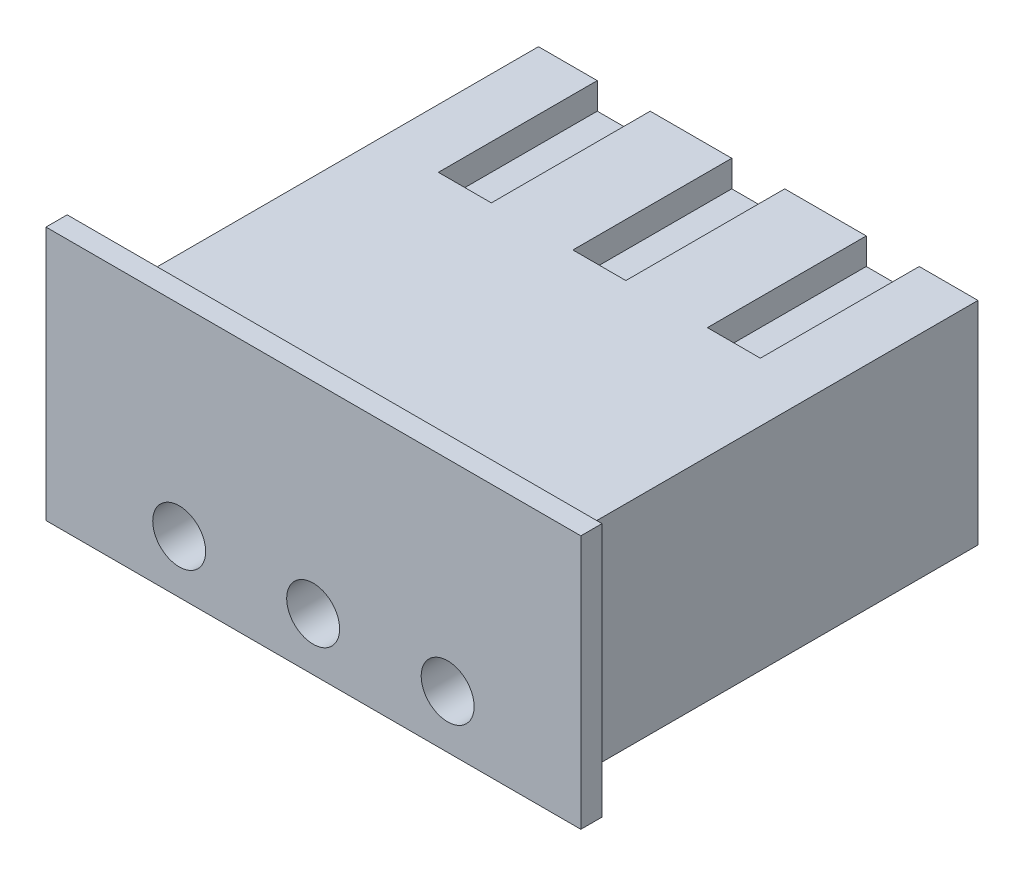
ISO-10303-21;
HEADER;
FILE_DESCRIPTION(('STEP AP214'),'2;1');
FILE_NAME('part.step','',(''),(''),'','','');
FILE_SCHEMA(('AUTOMOTIVE_DESIGN { 1 0 10303 214 1 1 1 1 }'));
ENDSEC;
DATA;
#1=APPLICATION_CONTEXT('core data for automotive mechanical design processes');
#2=APPLICATION_PROTOCOL_DEFINITION('international standard','automotive_design',2000,#1);
#3=PRODUCT_CONTEXT('',#1,'mechanical');
#4=PRODUCT('Part','Part','',(#3));
#5=PRODUCT_RELATED_PRODUCT_CATEGORY('part','',(#4));
#6=PRODUCT_DEFINITION_FORMATION('','',#4);
#7=PRODUCT_DEFINITION_CONTEXT('part definition',#1,'design');
#8=PRODUCT_DEFINITION('design','',#6,#7);
#9=PRODUCT_DEFINITION_SHAPE('','',#8);
#10=(LENGTH_UNIT() NAMED_UNIT(*) SI_UNIT(.MILLI.,.METRE.));
#11=(NAMED_UNIT(*) PLANE_ANGLE_UNIT() SI_UNIT($,.RADIAN.));
#12=(NAMED_UNIT(*) SI_UNIT($,.STERADIAN.) SOLID_ANGLE_UNIT());
#13=UNCERTAINTY_MEASURE_WITH_UNIT(LENGTH_MEASURE(1.E-05),#10,'distance_accuracy_value','');
#14=(GEOMETRIC_REPRESENTATION_CONTEXT(3) GLOBAL_UNCERTAINTY_ASSIGNED_CONTEXT((#13)) GLOBAL_UNIT_ASSIGNED_CONTEXT((#10,
#11,#12)) REPRESENTATION_CONTEXT('',''));
#15=CARTESIAN_POINT('',(0.,0.,0.));
#16=DIRECTION('',(0.,0.,1.));
#17=DIRECTION('',(1.,0.,0.));
#18=AXIS2_PLACEMENT_3D('',#15,#16,#17);
#19=CARTESIAN_POINT('',(0.,4.,8.));
#20=DIRECTION('',(0.,-1.,0.));
#21=DIRECTION('',(0.,0.,-1.));
#22=AXIS2_PLACEMENT_3D('',#19,#20,#21);
#23=PLANE('',#22);
#24=DIRECTION('',(0.,0.,1.));
#25=VECTOR('',#24,1.);
#26=CARTESIAN_POINT('',(1.11,4.,-1.2E-05));
#27=LINE('',#26,#25);
#28=CARTESIAN_POINT('',(1.11,4.,0.));
#29=VERTEX_POINT('',#28);
#30=CARTESIAN_POINT('',(1.11,4.,3.));
#31=VERTEX_POINT('',#30);
#32=EDGE_CURVE('E117',#29,#31,#27,.T.);
#33=ORIENTED_EDGE('',*,*,#32,.F.);
#34=DIRECTION('',(1.,0.,0.));
#35=VECTOR('',#34,1.);
#36=CARTESIAN_POINT('',(0.,4.,0.));
#37=LINE('',#36,#35);
#38=CARTESIAN_POINT('',(0.,4.,0.));
#39=VERTEX_POINT('',#38);
#40=EDGE_CURVE('E133',#29,#39,#37,.F.);
#41=ORIENTED_EDGE('',*,*,#40,.T.);
#42=DIRECTION('',(0.,0.,-1.));
#43=VECTOR('',#42,1.);
#44=CARTESIAN_POINT('',(0.,4.,8.));
#45=LINE('',#44,#43);
#46=CARTESIAN_POINT('',(0.,4.,8.));
#47=VERTEX_POINT('',#46);
#48=EDGE_CURVE('E250',#47,#39,#45,.T.);
#49=ORIENTED_EDGE('',*,*,#48,.F.);
#50=DIRECTION('',(-1.,0.,0.));
#51=VECTOR('',#50,1.);
#52=CARTESIAN_POINT('',(0.,4.,8.));
#53=LINE('',#52,#51);
#54=CARTESIAN_POINT('',(8.3,4.,8.));
#55=VERTEX_POINT('',#54);
#56=EDGE_CURVE('E245',#55,#47,#53,.T.);
#57=ORIENTED_EDGE('',*,*,#56,.F.);
#58=DIRECTION('',(0.,0.,-1.));
#59=VECTOR('',#58,1.);
#60=CARTESIAN_POINT('',(8.3,4.,8.));
#61=LINE('',#60,#59);
#62=CARTESIAN_POINT('',(8.3,4.,0.));
#63=VERTEX_POINT('',#62);
#64=EDGE_CURVE('E253',#55,#63,#61,.T.);
#65=ORIENTED_EDGE('',*,*,#64,.T.);
#66=DIRECTION('',(1.,0.,0.));
#67=VECTOR('',#66,1.);
#68=CARTESIAN_POINT('',(0.,4.,0.));
#69=LINE('',#68,#67);
#70=CARTESIAN_POINT('',(7.19,4.,0.));
#71=VERTEX_POINT('',#70);
#72=EDGE_CURVE('E243',#63,#71,#69,.F.);
#73=ORIENTED_EDGE('',*,*,#72,.T.);
#74=DIRECTION('',(0.,0.,1.));
#75=VECTOR('',#74,1.);
#76=CARTESIAN_POINT('',(7.19,4.,-1.2E-05));
#77=LINE('',#76,#75);
#78=CARTESIAN_POINT('',(7.19,4.,3.));
#79=VERTEX_POINT('',#78);
#80=EDGE_CURVE('E172',#71,#79,#77,.T.);
#81=ORIENTED_EDGE('',*,*,#80,.T.);
#82=DIRECTION('',(1.,0.,0.));
#83=VECTOR('',#82,1.);
#84=CARTESIAN_POINT('',(7.19,4.,3.));
#85=LINE('',#84,#83);
#86=CARTESIAN_POINT('',(6.19,4.,3.));
#87=VERTEX_POINT('',#86);
#88=EDGE_CURVE('E270',#87,#79,#85,.T.);
#89=ORIENTED_EDGE('',*,*,#88,.F.);
#90=DIRECTION('',(0.,0.,1.));
#91=VECTOR('',#90,1.);
#92=CARTESIAN_POINT('',(6.19,4.,-1.2E-05));
#93=LINE('',#92,#91);
#94=CARTESIAN_POINT('',(6.19,4.,0.));
#95=VERTEX_POINT('',#94);
#96=EDGE_CURVE('E180',#95,#87,#93,.T.);
#97=ORIENTED_EDGE('',*,*,#96,.F.);
#98=DIRECTION('',(1.,0.,0.));
#99=VECTOR('',#98,1.);
#100=CARTESIAN_POINT('',(0.,4.,0.));
#101=LINE('',#100,#99);
#102=CARTESIAN_POINT('',(4.65,4.,0.));
#103=VERTEX_POINT('',#102);
#104=EDGE_CURVE('E148',#95,#103,#101,.F.);
#105=ORIENTED_EDGE('',*,*,#104,.T.);
#106=DIRECTION('',(0.,0.,1.));
#107=VECTOR('',#106,1.);
#108=CARTESIAN_POINT('',(4.65,4.,-1.2E-05));
#109=LINE('',#108,#107);
#110=CARTESIAN_POINT('',(4.65,4.,3.));
#111=VERTEX_POINT('',#110);
#112=EDGE_CURVE('E189',#103,#111,#109,.T.);
#113=ORIENTED_EDGE('',*,*,#112,.T.);
#114=DIRECTION('',(1.,0.,0.));
#115=VECTOR('',#114,1.);
#116=CARTESIAN_POINT('',(4.65,4.,3.));
#117=LINE('',#116,#115);
#118=CARTESIAN_POINT('',(3.65,4.,3.));
#119=VERTEX_POINT('',#118);
#120=EDGE_CURVE('E265',#119,#111,#117,.T.);
#121=ORIENTED_EDGE('',*,*,#120,.F.);
#122=DIRECTION('',(0.,0.,1.));
#123=VECTOR('',#122,1.);
#124=CARTESIAN_POINT('',(3.65,4.,-1.2E-05));
#125=LINE('',#124,#123);
#126=CARTESIAN_POINT('',(3.65,4.,0.));
#127=VERTEX_POINT('',#126);
#128=EDGE_CURVE('E186',#127,#119,#125,.T.);
#129=ORIENTED_EDGE('',*,*,#128,.F.);
#130=DIRECTION('',(1.,0.,0.));
#131=VECTOR('',#130,1.);
#132=CARTESIAN_POINT('',(0.,4.,0.));
#133=LINE('',#132,#131);
#134=CARTESIAN_POINT('',(2.11,4.,0.));
#135=VERTEX_POINT('',#134);
#136=EDGE_CURVE('E142',#127,#135,#133,.F.);
#137=ORIENTED_EDGE('',*,*,#136,.T.);
#138=DIRECTION('',(0.,0.,1.));
#139=VECTOR('',#138,1.);
#140=CARTESIAN_POINT('',(2.11,4.,-1.2E-05));
#141=LINE('',#140,#139);
#142=CARTESIAN_POINT('',(2.11,4.,3.));
#143=VERTEX_POINT('',#142);
#144=EDGE_CURVE('E127',#135,#143,#141,.T.);
#145=ORIENTED_EDGE('',*,*,#144,.T.);
#146=DIRECTION('',(1.,0.,0.));
#147=VECTOR('',#146,1.);
#148=CARTESIAN_POINT('',(2.11,4.,3.));
#149=LINE('',#148,#147);
#150=EDGE_CURVE('E135',#31,#143,#149,.T.);
#151=ORIENTED_EDGE('',*,*,#150,.F.);
#152=EDGE_LOOP('',(#33,#41,#49,#57,#65,#73,#81,#89,#97,#105,#113,#121,#129,#137,#145,#151));
#153=FACE_BOUND('',#152,.T.);
#154=ADVANCED_FACE('F43',(#153),#23,.F.);
#155=CARTESIAN_POINT('',(0.,0.,8.));
#156=DIRECTION('',(1.,0.,0.));
#157=DIRECTION('',(0.,0.,-1.));
#158=AXIS2_PLACEMENT_3D('',#155,#156,#157);
#159=PLANE('',#158);
#160=DIRECTION('',(0.,-1.,0.));
#161=VECTOR('',#160,1.);
#162=CARTESIAN_POINT('',(0.,0.,0.));
#163=LINE('',#162,#161);
#164=CARTESIAN_POINT('',(0.,0.,0.));
#165=VERTEX_POINT('',#164);
#166=EDGE_CURVE('E143',#39,#165,#163,.T.);
#167=ORIENTED_EDGE('',*,*,#166,.T.);
#168=DIRECTION('',(0.,0.,-1.));
#169=VECTOR('',#168,1.);
#170=CARTESIAN_POINT('',(0.,0.,8.));
#171=LINE('',#170,#169);
#172=CARTESIAN_POINT('',(0.,0.,8.));
#173=VERTEX_POINT('',#172);
#174=EDGE_CURVE('E11',#173,#165,#171,.T.);
#175=ORIENTED_EDGE('',*,*,#174,.F.);
#176=DIRECTION('',(0.,-1.,0.));
#177=VECTOR('',#176,1.);
#178=CARTESIAN_POINT('',(0.,0.,8.));
#179=LINE('',#178,#177);
#180=EDGE_CURVE('E240',#47,#173,#179,.T.);
#181=ORIENTED_EDGE('',*,*,#180,.F.);
#182=ORIENTED_EDGE('',*,*,#48,.T.);
#183=EDGE_LOOP('',(#167,#175,#181,#182));
#184=FACE_BOUND('',#183,.T.);
#185=ADVANCED_FACE('F44',(#184),#159,.F.);
#186=CARTESIAN_POINT('',(0.,0.,8.));
#187=DIRECTION('',(0.,1.,0.));
#188=DIRECTION('',(0.,0.,1.));
#189=AXIS2_PLACEMENT_3D('',#186,#187,#188);
#190=PLANE('',#189);
#191=DIRECTION('',(1.,0.,0.));
#192=VECTOR('',#191,1.);
#193=CARTESIAN_POINT('',(0.,0.,0.));
#194=LINE('',#193,#192);
#195=CARTESIAN_POINT('',(8.3,0.,0.));
#196=VERTEX_POINT('',#195);
#197=EDGE_CURVE('E146',#165,#196,#194,.T.);
#198=ORIENTED_EDGE('',*,*,#197,.T.);
#199=DIRECTION('',(0.,0.,-1.));
#200=VECTOR('',#199,1.);
#201=CARTESIAN_POINT('',(8.3,0.,8.));
#202=LINE('',#201,#200);
#203=CARTESIAN_POINT('',(8.3,0.,8.));
#204=VERTEX_POINT('',#203);
#205=EDGE_CURVE('E52',#204,#196,#202,.T.);
#206=ORIENTED_EDGE('',*,*,#205,.F.);
#207=DIRECTION('',(1.,0.,0.));
#208=VECTOR('',#207,1.);
#209=CARTESIAN_POINT('',(-0.9,0.,8.));
#210=LINE('',#209,#208);
#211=CARTESIAN_POINT('',(9.2,0.,8.));
#212=VERTEX_POINT('',#211);
#213=EDGE_CURVE('E220',#204,#212,#210,.T.);
#214=ORIENTED_EDGE('',*,*,#213,.T.);
#215=DIRECTION('',(0.,0.,-1.));
#216=VECTOR('',#215,1.);
#217=CARTESIAN_POINT('',(9.2,0.,8.4));
#218=LINE('',#217,#216);
#219=CARTESIAN_POINT('',(9.2,0.,8.4));
#220=VERTEX_POINT('',#219);
#221=EDGE_CURVE('E233',#220,#212,#218,.T.);
#222=ORIENTED_EDGE('',*,*,#221,.F.);
#223=DIRECTION('',(1.,0.,0.));
#224=VECTOR('',#223,1.);
#225=CARTESIAN_POINT('',(-0.9,0.,8.4));
#226=LINE('',#225,#224);
#227=CARTESIAN_POINT('',(-0.9,0.,8.4));
#228=VERTEX_POINT('',#227);
#229=EDGE_CURVE('E204',#228,#220,#226,.T.);
#230=ORIENTED_EDGE('',*,*,#229,.F.);
#231=DIRECTION('',(0.,0.,-1.));
#232=VECTOR('',#231,1.);
#233=CARTESIAN_POINT('',(-0.9,0.,8.4));
#234=LINE('',#233,#232);
#235=CARTESIAN_POINT('',(-0.9,0.,8.));
#236=VERTEX_POINT('',#235);
#237=EDGE_CURVE('E232',#228,#236,#234,.T.);
#238=ORIENTED_EDGE('',*,*,#237,.T.);
#239=EDGE_CURVE('E217',#236,#173,#210,.T.);
#240=ORIENTED_EDGE('',*,*,#239,.T.);
#241=ORIENTED_EDGE('',*,*,#174,.T.);
#242=EDGE_LOOP('',(#198,#206,#214,#222,#230,#238,#240,#241));
#243=FACE_BOUND('',#242,.T.);
#244=ADVANCED_FACE('F368',(#243),#190,.F.);
#245=CARTESIAN_POINT('',(8.3,0.,8.));
#246=DIRECTION('',(-1.,0.,0.));
#247=DIRECTION('',(0.,0.,1.));
#248=AXIS2_PLACEMENT_3D('',#245,#246,#247);
#249=PLANE('',#248);
#250=DIRECTION('',(0.,1.,0.));
#251=VECTOR('',#250,1.);
#252=CARTESIAN_POINT('',(8.3,0.,0.));
#253=LINE('',#252,#251);
#254=EDGE_CURVE('E141',#196,#63,#253,.T.);
#255=ORIENTED_EDGE('',*,*,#254,.T.);
#256=ORIENTED_EDGE('',*,*,#64,.F.);
#257=DIRECTION('',(0.,1.,0.));
#258=VECTOR('',#257,1.);
#259=CARTESIAN_POINT('',(8.3,0.,8.));
#260=LINE('',#259,#258);
#261=EDGE_CURVE('E238',#204,#55,#260,.T.);
#262=ORIENTED_EDGE('',*,*,#261,.F.);
#263=ORIENTED_EDGE('',*,*,#205,.T.);
#264=EDGE_LOOP('',(#255,#256,#262,#263));
#265=FACE_BOUND('',#264,.T.);
#266=ADVANCED_FACE('F367',(#265),#249,.F.);
#267=CARTESIAN_POINT('',(0.,0.,0.));
#268=DIRECTION('',(0.,0.,-1.));
#269=DIRECTION('',(-1.,0.,0.));
#270=AXIS2_PLACEMENT_3D('',#267,#268,#269);
#271=PLANE('',#270);
#272=CARTESIAN_POINT('',(6.68483856446167,0.999999999999999,0.));
#273=DIRECTION('',(0.,0.,-1.));
#274=DIRECTION('',(-1.,0.,0.));
#275=AXIS2_PLACEMENT_3D('',#272,#273,#274);
#276=CIRCLE('',#275,0.500000000000001);
#277=CARTESIAN_POINT('',(6.18483856446167,0.999999999999999,0.));
#278=VERTEX_POINT('',#277);
#279=EDGE_CURVE('E154',#278,#278,#276,.T.);
#280=ORIENTED_EDGE('',*,*,#279,.F.);
#281=EDGE_LOOP('',(#280));
#282=FACE_BOUND('',#281,.T.);
#283=CARTESIAN_POINT('',(4.14483856446167,0.999999999999999,0.));
#284=DIRECTION('',(0.,0.,-1.));
#285=DIRECTION('',(-1.,0.,0.));
#286=AXIS2_PLACEMENT_3D('',#283,#284,#285);
#287=CIRCLE('',#286,0.5);
#288=CARTESIAN_POINT('',(3.64483856446167,0.999999999999999,0.));
#289=VERTEX_POINT('',#288);
#290=EDGE_CURVE('E421',#289,#289,#287,.T.);
#291=ORIENTED_EDGE('',*,*,#290,.F.);
#292=EDGE_LOOP('',(#291));
#293=FACE_BOUND('',#292,.T.);
#294=CARTESIAN_POINT('',(1.61516143553833,1.,0.));
#295=DIRECTION('',(0.,0.,-1.));
#296=DIRECTION('',(-1.,0.,0.));
#297=AXIS2_PLACEMENT_3D('',#294,#295,#296);
#298=CIRCLE('',#297,0.5);
#299=CARTESIAN_POINT('',(1.11516143553833,1.,0.));
#300=VERTEX_POINT('',#299);
#301=EDGE_CURVE('E426',#300,#300,#298,.T.);
#302=ORIENTED_EDGE('',*,*,#301,.F.);
#303=EDGE_LOOP('',(#302));
#304=FACE_BOUND('',#303,.T.);
#305=DIRECTION('',(0.,-1.,0.));
#306=VECTOR('',#305,1.);
#307=CARTESIAN_POINT('',(2.11,4.,0.));
#308=LINE('',#307,#306);
#309=CARTESIAN_POINT('',(2.11,3.5,0.));
#310=VERTEX_POINT('',#309);
#311=EDGE_CURVE('E269',#135,#310,#308,.T.);
#312=ORIENTED_EDGE('',*,*,#311,.F.);
#313=ORIENTED_EDGE('',*,*,#136,.F.);
#314=DIRECTION('',(0.,1.,0.));
#315=VECTOR('',#314,1.);
#316=CARTESIAN_POINT('',(3.65,4.,0.));
#317=LINE('',#316,#315);
#318=CARTESIAN_POINT('',(3.65,3.5,0.));
#319=VERTEX_POINT('',#318);
#320=EDGE_CURVE('E193',#319,#127,#317,.T.);
#321=ORIENTED_EDGE('',*,*,#320,.F.);
#322=DIRECTION('',(-1.,0.,0.));
#323=VECTOR('',#322,1.);
#324=CARTESIAN_POINT('',(4.65,3.5,0.));
#325=LINE('',#324,#323);
#326=CARTESIAN_POINT('',(4.65,3.5,0.));
#327=VERTEX_POINT('',#326);
#328=EDGE_CURVE('E256',#327,#319,#325,.T.);
#329=ORIENTED_EDGE('',*,*,#328,.F.);
#330=DIRECTION('',(0.,-1.,0.));
#331=VECTOR('',#330,1.);
#332=CARTESIAN_POINT('',(4.65,4.,0.));
#333=LINE('',#332,#331);
#334=EDGE_CURVE('E257',#103,#327,#333,.T.);
#335=ORIENTED_EDGE('',*,*,#334,.F.);
#336=ORIENTED_EDGE('',*,*,#104,.F.);
#337=DIRECTION('',(0.,1.,0.));
#338=VECTOR('',#337,1.);
#339=CARTESIAN_POINT('',(6.19,4.,0.));
#340=LINE('',#339,#338);
#341=CARTESIAN_POINT('',(6.19,3.5,0.));
#342=VERTEX_POINT('',#341);
#343=EDGE_CURVE('E178',#342,#95,#340,.T.);
#344=ORIENTED_EDGE('',*,*,#343,.F.);
#345=DIRECTION('',(-1.,0.,0.));
#346=VECTOR('',#345,1.);
#347=CARTESIAN_POINT('',(7.19,3.5,0.));
#348=LINE('',#347,#346);
#349=CARTESIAN_POINT('',(7.19,3.5,0.));
#350=VERTEX_POINT('',#349);
#351=EDGE_CURVE('E262',#350,#342,#348,.T.);
#352=ORIENTED_EDGE('',*,*,#351,.F.);
#353=DIRECTION('',(0.,-1.,0.));
#354=VECTOR('',#353,1.);
#355=CARTESIAN_POINT('',(7.19,4.,0.));
#356=LINE('',#355,#354);
#357=EDGE_CURVE('E266',#71,#350,#356,.T.);
#358=ORIENTED_EDGE('',*,*,#357,.F.);
#359=ORIENTED_EDGE('',*,*,#72,.F.);
#360=ORIENTED_EDGE('',*,*,#254,.F.);
#361=ORIENTED_EDGE('',*,*,#197,.F.);
#362=ORIENTED_EDGE('',*,*,#166,.F.);
#363=ORIENTED_EDGE('',*,*,#40,.F.);
#364=DIRECTION('',(0.,1.,0.));
#365=VECTOR('',#364,1.);
#366=CARTESIAN_POINT('',(1.11,4.,0.));
#367=LINE('',#366,#365);
#368=CARTESIAN_POINT('',(1.11,3.5,0.));
#369=VERTEX_POINT('',#368);
#370=EDGE_CURVE('E113',#369,#29,#367,.T.);
#371=ORIENTED_EDGE('',*,*,#370,.F.);
#372=DIRECTION('',(-1.,0.,0.));
#373=VECTOR('',#372,1.);
#374=CARTESIAN_POINT('',(2.11,3.5,0.));
#375=LINE('',#374,#373);
#376=EDGE_CURVE('E124',#310,#369,#375,.T.);
#377=ORIENTED_EDGE('',*,*,#376,.F.);
#378=EDGE_LOOP('',(#312,#313,#321,#329,#335,#336,#344,#352,#358,#359,#360,#361,#362,#363,#371,#377));
#379=FACE_BOUND('',#378,.T.);
#380=ADVANCED_FACE('F136',(#282,#293,#304,#379),#271,.T.);
#381=CARTESIAN_POINT('',(-0.9,0.,8.4));
#382=DIRECTION('',(1.,0.,0.));
#383=DIRECTION('',(0.,0.,-1.));
#384=AXIS2_PLACEMENT_3D('',#381,#382,#383);
#385=PLANE('',#384);
#386=DIRECTION('',(0.,-1.,0.));
#387=VECTOR('',#386,1.);
#388=CARTESIAN_POINT('',(-0.9,0.,8.));
#389=LINE('',#388,#387);
#390=CARTESIAN_POINT('',(-0.9,4.8,8.));
#391=VERTEX_POINT('',#390);
#392=EDGE_CURVE('E194',#391,#236,#389,.T.);
#393=ORIENTED_EDGE('',*,*,#392,.T.);
#394=ORIENTED_EDGE('',*,*,#237,.F.);
#395=DIRECTION('',(0.,-1.,0.));
#396=VECTOR('',#395,1.);
#397=CARTESIAN_POINT('',(-0.9,0.,8.4));
#398=LINE('',#397,#396);
#399=CARTESIAN_POINT('',(-0.9,4.8,8.4));
#400=VERTEX_POINT('',#399);
#401=EDGE_CURVE('E203',#400,#228,#398,.T.);
#402=ORIENTED_EDGE('',*,*,#401,.F.);
#403=DIRECTION('',(0.,0.,-1.));
#404=VECTOR('',#403,1.);
#405=CARTESIAN_POINT('',(-0.9,4.8,8.4));
#406=LINE('',#405,#404);
#407=EDGE_CURVE('E212',#400,#391,#406,.T.);
#408=ORIENTED_EDGE('',*,*,#407,.T.);
#409=EDGE_LOOP('',(#393,#394,#402,#408));
#410=FACE_BOUND('',#409,.T.);
#411=ADVANCED_FACE('F394',(#410),#385,.F.);
#412=CARTESIAN_POINT('',(9.2,0.,8.4));
#413=DIRECTION('',(-1.,0.,0.));
#414=DIRECTION('',(0.,0.,1.));
#415=AXIS2_PLACEMENT_3D('',#412,#413,#414);
#416=PLANE('',#415);
#417=DIRECTION('',(0.,1.,0.));
#418=VECTOR('',#417,1.);
#419=CARTESIAN_POINT('',(9.2,0.,8.));
#420=LINE('',#419,#418);
#421=CARTESIAN_POINT('',(9.2,4.8,8.));
#422=VERTEX_POINT('',#421);
#423=EDGE_CURVE('E222',#212,#422,#420,.T.);
#424=ORIENTED_EDGE('',*,*,#423,.T.);
#425=DIRECTION('',(0.,0.,-1.));
#426=VECTOR('',#425,1.);
#427=CARTESIAN_POINT('',(9.2,4.8,8.4));
#428=LINE('',#427,#426);
#429=CARTESIAN_POINT('',(9.2,4.8,8.4));
#430=VERTEX_POINT('',#429);
#431=EDGE_CURVE('E227',#430,#422,#428,.T.);
#432=ORIENTED_EDGE('',*,*,#431,.F.);
#433=DIRECTION('',(0.,1.,0.));
#434=VECTOR('',#433,1.);
#435=CARTESIAN_POINT('',(9.2,0.,8.4));
#436=LINE('',#435,#434);
#437=EDGE_CURVE('E208',#220,#430,#436,.T.);
#438=ORIENTED_EDGE('',*,*,#437,.F.);
#439=ORIENTED_EDGE('',*,*,#221,.T.);
#440=EDGE_LOOP('',(#424,#432,#438,#439));
#441=FACE_BOUND('',#440,.T.);
#442=ADVANCED_FACE('F385',(#441),#416,.F.);
#443=CARTESIAN_POINT('',(-0.9,4.8,8.4));
#444=DIRECTION('',(0.,-1.,0.));
#445=DIRECTION('',(0.,0.,-1.));
#446=AXIS2_PLACEMENT_3D('',#443,#444,#445);
#447=PLANE('',#446);
#448=DIRECTION('',(-1.,0.,0.));
#449=VECTOR('',#448,1.);
#450=CARTESIAN_POINT('',(-0.9,4.8,8.));
#451=LINE('',#450,#449);
#452=EDGE_CURVE('E202',#422,#391,#451,.T.);
#453=ORIENTED_EDGE('',*,*,#452,.T.);
#454=ORIENTED_EDGE('',*,*,#407,.F.);
#455=DIRECTION('',(-1.,0.,0.));
#456=VECTOR('',#455,1.);
#457=CARTESIAN_POINT('',(-0.9,4.8,8.4));
#458=LINE('',#457,#456);
#459=EDGE_CURVE('E211',#430,#400,#458,.T.);
#460=ORIENTED_EDGE('',*,*,#459,.F.);
#461=ORIENTED_EDGE('',*,*,#431,.T.);
#462=EDGE_LOOP('',(#453,#454,#460,#461));
#463=FACE_BOUND('',#462,.T.);
#464=ADVANCED_FACE('F483',(#463),#447,.F.);
#465=CARTESIAN_POINT('',(0.,0.,8.4));
#466=DIRECTION('',(0.,0.,-1.));
#467=DIRECTION('',(-1.,0.,0.));
#468=AXIS2_PLACEMENT_3D('',#465,#466,#467);
#469=PLANE('',#468);
#470=CARTESIAN_POINT('',(6.68483856446167,0.999999999999999,8.4));
#471=DIRECTION('',(0.,0.,-1.));
#472=DIRECTION('',(-1.,0.,0.));
#473=AXIS2_PLACEMENT_3D('',#470,#471,#472);
#474=CIRCLE('',#473,0.500000000000001);
#475=CARTESIAN_POINT('',(6.18483856446167,0.999999999999999,8.4));
#476=VERTEX_POINT('',#475);
#477=EDGE_CURVE('E50',#476,#476,#474,.T.);
#478=ORIENTED_EDGE('',*,*,#477,.T.);
#479=EDGE_LOOP('',(#478));
#480=FACE_BOUND('',#479,.T.);
#481=CARTESIAN_POINT('',(4.14483856446167,0.999999999999999,8.4));
#482=DIRECTION('',(0.,0.,-1.));
#483=DIRECTION('',(-1.,0.,0.));
#484=AXIS2_PLACEMENT_3D('',#481,#482,#483);
#485=CIRCLE('',#484,0.5);
#486=CARTESIAN_POINT('',(3.64483856446167,0.999999999999999,8.4));
#487=VERTEX_POINT('',#486);
#488=EDGE_CURVE('E152',#487,#487,#485,.T.);
#489=ORIENTED_EDGE('',*,*,#488,.T.);
#490=EDGE_LOOP('',(#489));
#491=FACE_BOUND('',#490,.T.);
#492=CARTESIAN_POINT('',(1.61516143553833,1.,8.4));
#493=DIRECTION('',(0.,0.,-1.));
#494=DIRECTION('',(-1.,0.,0.));
#495=AXIS2_PLACEMENT_3D('',#492,#493,#494);
#496=CIRCLE('',#495,0.5);
#497=CARTESIAN_POINT('',(1.11516143553833,1.,8.4));
#498=VERTEX_POINT('',#497);
#499=EDGE_CURVE('E155',#498,#498,#496,.T.);
#500=ORIENTED_EDGE('',*,*,#499,.T.);
#501=EDGE_LOOP('',(#500));
#502=FACE_BOUND('',#501,.T.);
#503=ORIENTED_EDGE('',*,*,#401,.T.);
#504=ORIENTED_EDGE('',*,*,#229,.T.);
#505=ORIENTED_EDGE('',*,*,#437,.T.);
#506=ORIENTED_EDGE('',*,*,#459,.T.);
#507=EDGE_LOOP('',(#503,#504,#505,#506));
#508=FACE_BOUND('',#507,.T.);
#509=ADVANCED_FACE('F387',(#480,#491,#502,#508),#469,.F.);
#510=CARTESIAN_POINT('',(0.,0.,8.));
#511=DIRECTION('',(0.,0.,-1.));
#512=DIRECTION('',(-1.,0.,0.));
#513=AXIS2_PLACEMENT_3D('',#510,#511,#512);
#514=PLANE('',#513);
#515=ORIENTED_EDGE('',*,*,#56,.T.);
#516=ORIENTED_EDGE('',*,*,#180,.T.);
#517=ORIENTED_EDGE('',*,*,#239,.F.);
#518=ORIENTED_EDGE('',*,*,#392,.F.);
#519=ORIENTED_EDGE('',*,*,#452,.F.);
#520=ORIENTED_EDGE('',*,*,#423,.F.);
#521=ORIENTED_EDGE('',*,*,#213,.F.);
#522=ORIENTED_EDGE('',*,*,#261,.T.);
#523=EDGE_LOOP('',(#515,#516,#517,#518,#519,#520,#521,#522));
#524=FACE_BOUND('',#523,.T.);
#525=ADVANCED_FACE('F376',(#524),#514,.T.);
#526=CARTESIAN_POINT('',(4.65,4.,-1.2E-05));
#527=DIRECTION('',(-1.,0.,0.));
#528=DIRECTION('',(0.,-1.,0.));
#529=AXIS2_PLACEMENT_3D('',#526,#527,#528);
#530=PLANE('',#529);
#531=ORIENTED_EDGE('',*,*,#112,.F.);
#532=ORIENTED_EDGE('',*,*,#334,.T.);
#533=DIRECTION('',(0.,0.,1.));
#534=VECTOR('',#533,1.);
#535=CARTESIAN_POINT('',(4.65,3.5,-1.2E-05));
#536=LINE('',#535,#534);
#537=CARTESIAN_POINT('',(4.65,3.5,3.));
#538=VERTEX_POINT('',#537);
#539=EDGE_CURVE('E195',#327,#538,#536,.T.);
#540=ORIENTED_EDGE('',*,*,#539,.T.);
#541=DIRECTION('',(0.,-1.,0.));
#542=VECTOR('',#541,1.);
#543=CARTESIAN_POINT('',(4.65,4.,3.));
#544=LINE('',#543,#542);
#545=EDGE_CURVE('E305',#111,#538,#544,.T.);
#546=ORIENTED_EDGE('',*,*,#545,.F.);
#547=EDGE_LOOP('',(#531,#532,#540,#546));
#548=FACE_BOUND('',#547,.T.);
#549=ADVANCED_FACE('F281',(#548),#530,.T.);
#550=CARTESIAN_POINT('',(4.65,3.5,-1.2E-05));
#551=DIRECTION('',(0.,1.,0.));
#552=DIRECTION('',(-1.,0.,0.));
#553=AXIS2_PLACEMENT_3D('',#550,#551,#552);
#554=PLANE('',#553);
#555=ORIENTED_EDGE('',*,*,#539,.F.);
#556=ORIENTED_EDGE('',*,*,#328,.T.);
#557=DIRECTION('',(0.,0.,1.));
#558=VECTOR('',#557,1.);
#559=CARTESIAN_POINT('',(3.65,3.5,-1.2E-05));
#560=LINE('',#559,#558);
#561=CARTESIAN_POINT('',(3.65,3.5,3.));
#562=VERTEX_POINT('',#561);
#563=EDGE_CURVE('E198',#319,#562,#560,.T.);
#564=ORIENTED_EDGE('',*,*,#563,.T.);
#565=DIRECTION('',(-1.,0.,0.));
#566=VECTOR('',#565,1.);
#567=CARTESIAN_POINT('',(4.65,3.5,3.));
#568=LINE('',#567,#566);
#569=EDGE_CURVE('E291',#538,#562,#568,.T.);
#570=ORIENTED_EDGE('',*,*,#569,.F.);
#571=EDGE_LOOP('',(#555,#556,#564,#570));
#572=FACE_BOUND('',#571,.T.);
#573=ADVANCED_FACE('F289',(#572),#554,.T.);
#574=CARTESIAN_POINT('',(3.65,4.,-1.2E-05));
#575=DIRECTION('',(1.,0.,0.));
#576=DIRECTION('',(0.,1.,0.));
#577=AXIS2_PLACEMENT_3D('',#574,#575,#576);
#578=PLANE('',#577);
#579=ORIENTED_EDGE('',*,*,#563,.F.);
#580=ORIENTED_EDGE('',*,*,#320,.T.);
#581=ORIENTED_EDGE('',*,*,#128,.T.);
#582=DIRECTION('',(0.,1.,0.));
#583=VECTOR('',#582,1.);
#584=CARTESIAN_POINT('',(3.65,4.,3.));
#585=LINE('',#584,#583);
#586=EDGE_CURVE('E303',#562,#119,#585,.T.);
#587=ORIENTED_EDGE('',*,*,#586,.F.);
#588=EDGE_LOOP('',(#579,#580,#581,#587));
#589=FACE_BOUND('',#588,.T.);
#590=ADVANCED_FACE('F320',(#589),#578,.T.);
#591=CARTESIAN_POINT('',(0.,0.,3.));
#592=DIRECTION('',(0.,0.,-1.));
#593=DIRECTION('',(-1.,0.,0.));
#594=AXIS2_PLACEMENT_3D('',#591,#592,#593);
#595=PLANE('',#594);
#596=ORIENTED_EDGE('',*,*,#545,.T.);
#597=ORIENTED_EDGE('',*,*,#569,.T.);
#598=ORIENTED_EDGE('',*,*,#586,.T.);
#599=ORIENTED_EDGE('',*,*,#120,.T.);
#600=EDGE_LOOP('',(#596,#597,#598,#599));
#601=FACE_BOUND('',#600,.T.);
#602=ADVANCED_FACE('F304',(#601),#595,.T.);
#603=CARTESIAN_POINT('',(7.19,4.,-1.2E-05));
#604=DIRECTION('',(-1.,0.,0.));
#605=DIRECTION('',(0.,-1.,0.));
#606=AXIS2_PLACEMENT_3D('',#603,#604,#605);
#607=PLANE('',#606);
#608=ORIENTED_EDGE('',*,*,#80,.F.);
#609=ORIENTED_EDGE('',*,*,#357,.T.);
#610=DIRECTION('',(0.,0.,1.));
#611=VECTOR('',#610,1.);
#612=CARTESIAN_POINT('',(7.19,3.5,-1.2E-05));
#613=LINE('',#612,#611);
#614=CARTESIAN_POINT('',(7.19,3.5,3.));
#615=VERTEX_POINT('',#614);
#616=EDGE_CURVE('E176',#350,#615,#613,.T.);
#617=ORIENTED_EDGE('',*,*,#616,.T.);
#618=DIRECTION('',(0.,-1.,0.));
#619=VECTOR('',#618,1.);
#620=CARTESIAN_POINT('',(7.19,4.,3.));
#621=LINE('',#620,#619);
#622=EDGE_CURVE('E308',#79,#615,#621,.T.);
#623=ORIENTED_EDGE('',*,*,#622,.F.);
#624=EDGE_LOOP('',(#608,#609,#617,#623));
#625=FACE_BOUND('',#624,.T.);
#626=ADVANCED_FACE('F446',(#625),#607,.T.);
#627=CARTESIAN_POINT('',(7.19,3.5,-1.2E-05));
#628=DIRECTION('',(0.,1.,0.));
#629=DIRECTION('',(0.,0.,1.));
#630=AXIS2_PLACEMENT_3D('',#627,#628,#629);
#631=PLANE('',#630);
#632=ORIENTED_EDGE('',*,*,#616,.F.);
#633=ORIENTED_EDGE('',*,*,#351,.T.);
#634=DIRECTION('',(0.,0.,1.));
#635=VECTOR('',#634,1.);
#636=CARTESIAN_POINT('',(6.19,3.5,-1.2E-05));
#637=LINE('',#636,#635);
#638=CARTESIAN_POINT('',(6.19,3.5,3.));
#639=VERTEX_POINT('',#638);
#640=EDGE_CURVE('E182',#342,#639,#637,.T.);
#641=ORIENTED_EDGE('',*,*,#640,.T.);
#642=DIRECTION('',(-1.,0.,0.));
#643=VECTOR('',#642,1.);
#644=CARTESIAN_POINT('',(7.19,3.5,3.));
#645=LINE('',#644,#643);
#646=EDGE_CURVE('E310',#615,#639,#645,.T.);
#647=ORIENTED_EDGE('',*,*,#646,.F.);
#648=EDGE_LOOP('',(#632,#633,#641,#647));
#649=FACE_BOUND('',#648,.T.);
#650=ADVANCED_FACE('F449',(#649),#631,.T.);
#651=CARTESIAN_POINT('',(6.19,4.,-1.2E-05));
#652=DIRECTION('',(1.,0.,0.));
#653=DIRECTION('',(0.,0.,-1.));
#654=AXIS2_PLACEMENT_3D('',#651,#652,#653);
#655=PLANE('',#654);
#656=ORIENTED_EDGE('',*,*,#640,.F.);
#657=ORIENTED_EDGE('',*,*,#343,.T.);
#658=ORIENTED_EDGE('',*,*,#96,.T.);
#659=DIRECTION('',(0.,1.,0.));
#660=VECTOR('',#659,1.);
#661=CARTESIAN_POINT('',(6.19,4.,3.));
#662=LINE('',#661,#660);
#663=EDGE_CURVE('E432',#639,#87,#662,.T.);
#664=ORIENTED_EDGE('',*,*,#663,.F.);
#665=EDGE_LOOP('',(#656,#657,#658,#664));
#666=FACE_BOUND('',#665,.T.);
#667=ADVANCED_FACE('F456',(#666),#655,.T.);
#668=CARTESIAN_POINT('',(0.,0.,3.));
#669=DIRECTION('',(0.,0.,-1.));
#670=DIRECTION('',(-1.,0.,0.));
#671=AXIS2_PLACEMENT_3D('',#668,#669,#670);
#672=PLANE('',#671);
#673=ORIENTED_EDGE('',*,*,#622,.T.);
#674=ORIENTED_EDGE('',*,*,#646,.T.);
#675=ORIENTED_EDGE('',*,*,#663,.T.);
#676=ORIENTED_EDGE('',*,*,#88,.T.);
#677=EDGE_LOOP('',(#673,#674,#675,#676));
#678=FACE_BOUND('',#677,.T.);
#679=ADVANCED_FACE('F445',(#678),#672,.T.);
#680=CARTESIAN_POINT('',(2.11,4.,-1.2E-05));
#681=DIRECTION('',(-1.,0.,0.));
#682=DIRECTION('',(0.,0.,1.));
#683=AXIS2_PLACEMENT_3D('',#680,#681,#682);
#684=PLANE('',#683);
#685=ORIENTED_EDGE('',*,*,#144,.F.);
#686=ORIENTED_EDGE('',*,*,#311,.T.);
#687=DIRECTION('',(0.,0.,1.));
#688=VECTOR('',#687,1.);
#689=CARTESIAN_POINT('',(2.11,3.5,-1.2E-05));
#690=LINE('',#689,#688);
#691=CARTESIAN_POINT('',(2.11,3.5,3.));
#692=VERTEX_POINT('',#691);
#693=EDGE_CURVE('E159',#310,#692,#690,.T.);
#694=ORIENTED_EDGE('',*,*,#693,.T.);
#695=DIRECTION('',(0.,-1.,0.));
#696=VECTOR('',#695,1.);
#697=CARTESIAN_POINT('',(2.11,4.,3.));
#698=LINE('',#697,#696);
#699=EDGE_CURVE('E185',#143,#692,#698,.T.);
#700=ORIENTED_EDGE('',*,*,#699,.F.);
#701=EDGE_LOOP('',(#685,#686,#694,#700));
#702=FACE_BOUND('',#701,.T.);
#703=ADVANCED_FACE('F317',(#702),#684,.T.);
#704=CARTESIAN_POINT('',(2.11,3.5,-1.2E-05));
#705=DIRECTION('',(0.,1.,0.));
#706=DIRECTION('',(-1.,0.,0.));
#707=AXIS2_PLACEMENT_3D('',#704,#705,#706);
#708=PLANE('',#707);
#709=ORIENTED_EDGE('',*,*,#693,.F.);
#710=ORIENTED_EDGE('',*,*,#376,.T.);
#711=DIRECTION('',(0.,0.,1.));
#712=VECTOR('',#711,1.);
#713=CARTESIAN_POINT('',(1.11,3.5,-1.2E-05));
#714=LINE('',#713,#712);
#715=CARTESIAN_POINT('',(1.11,3.5,3.));
#716=VERTEX_POINT('',#715);
#717=EDGE_CURVE('E123',#369,#716,#714,.T.);
#718=ORIENTED_EDGE('',*,*,#717,.T.);
#719=DIRECTION('',(-1.,0.,0.));
#720=VECTOR('',#719,1.);
#721=CARTESIAN_POINT('',(2.11,3.5,3.));
#722=LINE('',#721,#720);
#723=EDGE_CURVE('E325',#692,#716,#722,.T.);
#724=ORIENTED_EDGE('',*,*,#723,.F.);
#725=EDGE_LOOP('',(#709,#710,#718,#724));
#726=FACE_BOUND('',#725,.T.);
#727=ADVANCED_FACE('F321',(#726),#708,.T.);
#728=CARTESIAN_POINT('',(1.11,4.,-1.2E-05));
#729=DIRECTION('',(1.,0.,0.));
#730=DIRECTION('',(0.,1.,0.));
#731=AXIS2_PLACEMENT_3D('',#728,#729,#730);
#732=PLANE('',#731);
#733=ORIENTED_EDGE('',*,*,#717,.F.);
#734=ORIENTED_EDGE('',*,*,#370,.T.);
#735=ORIENTED_EDGE('',*,*,#32,.T.);
#736=DIRECTION('',(0.,1.,0.));
#737=VECTOR('',#736,1.);
#738=CARTESIAN_POINT('',(1.11,4.,3.));
#739=LINE('',#738,#737);
#740=EDGE_CURVE('E64',#716,#31,#739,.T.);
#741=ORIENTED_EDGE('',*,*,#740,.F.);
#742=EDGE_LOOP('',(#733,#734,#735,#741));
#743=FACE_BOUND('',#742,.T.);
#744=ADVANCED_FACE('F119',(#743),#732,.T.);
#745=CARTESIAN_POINT('',(0.,0.,3.));
#746=DIRECTION('',(0.,0.,-1.));
#747=DIRECTION('',(-1.,0.,0.));
#748=AXIS2_PLACEMENT_3D('',#745,#746,#747);
#749=PLANE('',#748);
#750=ORIENTED_EDGE('',*,*,#699,.T.);
#751=ORIENTED_EDGE('',*,*,#723,.T.);
#752=ORIENTED_EDGE('',*,*,#740,.T.);
#753=ORIENTED_EDGE('',*,*,#150,.T.);
#754=EDGE_LOOP('',(#750,#751,#752,#753));
#755=FACE_BOUND('',#754,.T.);
#756=ADVANCED_FACE('F326',(#755),#749,.T.);
#757=CARTESIAN_POINT('',(1.61516143553833,1.,10.));
#758=DIRECTION('',(0.,0.,-1.));
#759=DIRECTION('',(-1.,0.,0.));
#760=AXIS2_PLACEMENT_3D('',#757,#758,#759);
#761=CYLINDRICAL_SURFACE('',#760,0.5);
#762=ORIENTED_EDGE('',*,*,#301,.T.);
#763=EDGE_LOOP('',(#762));
#764=FACE_BOUND('',#763,.T.);
#765=ORIENTED_EDGE('',*,*,#499,.F.);
#766=EDGE_LOOP('',(#765));
#767=FACE_BOUND('',#766,.T.);
#768=ADVANCED_FACE('F464',(#764,#767),#761,.F.);
#769=CARTESIAN_POINT('',(4.14483856446167,0.999999999999999,10.));
#770=DIRECTION('',(0.,0.,-1.));
#771=DIRECTION('',(-1.,0.,0.));
#772=AXIS2_PLACEMENT_3D('',#769,#770,#771);
#773=CYLINDRICAL_SURFACE('',#772,0.5);
#774=ORIENTED_EDGE('',*,*,#290,.T.);
#775=EDGE_LOOP('',(#774));
#776=FACE_BOUND('',#775,.T.);
#777=ORIENTED_EDGE('',*,*,#488,.F.);
#778=EDGE_LOOP('',(#777));
#779=FACE_BOUND('',#778,.T.);
#780=ADVANCED_FACE('F591',(#776,#779),#773,.F.);
#781=CARTESIAN_POINT('',(6.68483856446167,0.999999999999999,10.));
#782=DIRECTION('',(0.,0.,-1.));
#783=DIRECTION('',(-1.,0.,0.));
#784=AXIS2_PLACEMENT_3D('',#781,#782,#783);
#785=CYLINDRICAL_SURFACE('',#784,0.500000000000001);
#786=ORIENTED_EDGE('',*,*,#279,.T.);
#787=EDGE_LOOP('',(#786));
#788=FACE_BOUND('',#787,.T.);
#789=ORIENTED_EDGE('',*,*,#477,.F.);
#790=EDGE_LOOP('',(#789));
#791=FACE_BOUND('',#790,.T.);
#792=ADVANCED_FACE('F597',(#788,#791),#785,.F.);
#793=CLOSED_SHELL('',(#154,#185,#244,#266,#380,#411,#442,#464,#509,#525,#549,#573,#590,#602,
#626,#650,#667,#679,#703,#727,#744,#756,#768,#780,#792));
#794=MANIFOLD_SOLID_BREP('B2',#793);
#795=ADVANCED_BREP_SHAPE_REPRESENTATION('',(#18,#794),#14);
#796=SHAPE_DEFINITION_REPRESENTATION(#9,#795);
ENDSEC;
END-ISO-10303-21;
